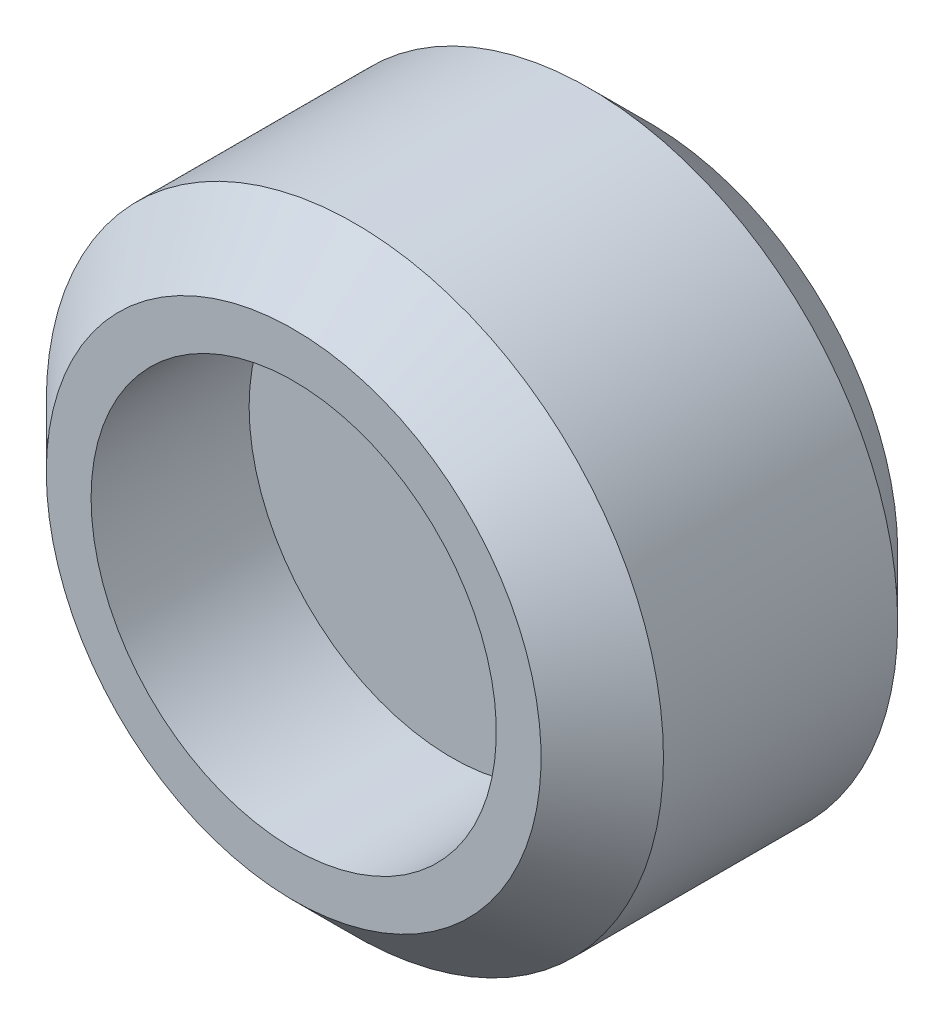
ISO-10303-21;
HEADER;
FILE_DESCRIPTION(('STEP AP214'),'2;1');
FILE_NAME('part.step','',(''),(''),'','','');
FILE_SCHEMA(('AUTOMOTIVE_DESIGN { 1 0 10303 214 1 1 1 1 }'));
ENDSEC;
DATA;
#1=APPLICATION_CONTEXT('core data for automotive mechanical design processes');
#2=APPLICATION_PROTOCOL_DEFINITION('international standard','automotive_design',2000,#1);
#3=PRODUCT_CONTEXT('',#1,'mechanical');
#4=PRODUCT('Part','Part','',(#3));
#5=PRODUCT_RELATED_PRODUCT_CATEGORY('part','',(#4));
#6=PRODUCT_DEFINITION_FORMATION('','',#4);
#7=PRODUCT_DEFINITION_CONTEXT('part definition',#1,'design');
#8=PRODUCT_DEFINITION('design','',#6,#7);
#9=PRODUCT_DEFINITION_SHAPE('','',#8);
#10=(LENGTH_UNIT() NAMED_UNIT(*) SI_UNIT(.MILLI.,.METRE.));
#11=(NAMED_UNIT(*) PLANE_ANGLE_UNIT() SI_UNIT($,.RADIAN.));
#12=(NAMED_UNIT(*) SI_UNIT($,.STERADIAN.) SOLID_ANGLE_UNIT());
#13=UNCERTAINTY_MEASURE_WITH_UNIT(LENGTH_MEASURE(1.E-05),#10,'distance_accuracy_value','');
#14=(GEOMETRIC_REPRESENTATION_CONTEXT(3) GLOBAL_UNCERTAINTY_ASSIGNED_CONTEXT((#13)) GLOBAL_UNIT_ASSIGNED_CONTEXT((#10,
#11,#12)) REPRESENTATION_CONTEXT('',''));
#15=CARTESIAN_POINT('',(0.,0.,0.));
#16=DIRECTION('',(0.,0.,1.));
#17=DIRECTION('',(1.,0.,0.));
#18=AXIS2_PLACEMENT_3D('',#15,#16,#17);
#19=CARTESIAN_POINT('',(0.,0.,4.9));
#20=DIRECTION('',(0.,0.,-1.));
#21=DIRECTION('',(-1.,0.,0.));
#22=AXIS2_PLACEMENT_3D('',#19,#20,#21);
#23=PLANE('',#22);
#24=CARTESIAN_POINT('',(0.,0.,4.9));
#25=DIRECTION('',(0.,0.,-1.));
#26=DIRECTION('',(-1.,0.,0.));
#27=AXIS2_PLACEMENT_3D('',#24,#25,#26);
#28=CIRCLE('',#27,5.);
#29=CARTESIAN_POINT('',(-5.,0.,4.9));
#30=VERTEX_POINT('',#29);
#31=EDGE_CURVE('E17',#30,#30,#28,.F.);
#32=ORIENTED_EDGE('',*,*,#31,.T.);
#33=EDGE_LOOP('',(#32));
#34=FACE_BOUND('',#33,.T.);
#35=ADVANCED_FACE('F14',(#34),#23,.F.);
#36=CARTESIAN_POINT('',(0.,0.,3.9));
#37=DIRECTION('',(0.,0.,1.));
#38=DIRECTION('',(1.,0.,0.));
#39=AXIS2_PLACEMENT_3D('',#36,#37,#38);
#40=PLANE('',#39);
#41=CARTESIAN_POINT('',(0.,0.,3.9));
#42=DIRECTION('',(0.,0.,1.));
#43=DIRECTION('',(1.,0.,0.));
#44=AXIS2_PLACEMENT_3D('',#41,#42,#43);
#45=CIRCLE('',#44,5.);
#46=CARTESIAN_POINT('',(5.,0.,3.9));
#47=VERTEX_POINT('',#46);
#48=EDGE_CURVE('E39',#47,#47,#45,.F.);
#49=ORIENTED_EDGE('',*,*,#48,.T.);
#50=EDGE_LOOP('',(#49));
#51=FACE_BOUND('',#50,.T.);
#52=ADVANCED_FACE('F51',(#51),#40,.F.);
#53=CARTESIAN_POINT('',(0.,0.,6.85));
#54=DIRECTION('',(0.,0.,-1.));
#55=DIRECTION('',(-1.,0.,0.));
#56=AXIS2_PLACEMENT_3D('',#53,#54,#55);
#57=CYLINDRICAL_SURFACE('',#56,5.);
#58=ORIENTED_EDGE('',*,*,#31,.F.);
#59=EDGE_LOOP('',(#58));
#60=FACE_BOUND('',#59,.T.);
#61=CARTESIAN_POINT('',(0.,0.,8.8));
#62=DIRECTION('',(0.,0.,-1.));
#63=DIRECTION('',(-1.,0.,0.));
#64=AXIS2_PLACEMENT_3D('',#61,#62,#63);
#65=CIRCLE('',#64,5.);
#66=CARTESIAN_POINT('',(-5.,0.,8.8));
#67=VERTEX_POINT('',#66);
#68=EDGE_CURVE('E37',#67,#67,#65,.T.);
#69=ORIENTED_EDGE('',*,*,#68,.F.);
#70=EDGE_LOOP('',(#69));
#71=FACE_BOUND('',#70,.T.);
#72=ADVANCED_FACE('F47',(#60,#71),#57,.F.);
#73=CARTESIAN_POINT('',(0.,0.,1.95));
#74=DIRECTION('',(0.,0.,1.));
#75=DIRECTION('',(1.,0.,0.));
#76=AXIS2_PLACEMENT_3D('',#73,#74,#75);
#77=CYLINDRICAL_SURFACE('',#76,5.);
#78=ORIENTED_EDGE('',*,*,#48,.F.);
#79=EDGE_LOOP('',(#78));
#80=FACE_BOUND('',#79,.T.);
#81=CARTESIAN_POINT('',(0.,0.,0.));
#82=DIRECTION('',(0.,0.,1.));
#83=DIRECTION('',(1.,0.,0.));
#84=AXIS2_PLACEMENT_3D('',#81,#82,#83);
#85=CIRCLE('',#84,5.);
#86=CARTESIAN_POINT('',(5.,0.,0.));
#87=VERTEX_POINT('',#86);
#88=EDGE_CURVE('E34',#87,#87,#85,.F.);
#89=ORIENTED_EDGE('',*,*,#88,.T.);
#90=EDGE_LOOP('',(#89));
#91=FACE_BOUND('',#90,.T.);
#92=ADVANCED_FACE('F50',(#80,#91),#77,.F.);
#93=CARTESIAN_POINT('',(0.,0.,8.8));
#94=DIRECTION('',(0.,0.,1.));
#95=DIRECTION('',(1.,0.,0.));
#96=AXIS2_PLACEMENT_3D('',#93,#94,#95);
#97=PLANE('',#96);
#98=ORIENTED_EDGE('',*,*,#68,.T.);
#99=EDGE_LOOP('',(#98));
#100=FACE_BOUND('',#99,.T.);
#101=CARTESIAN_POINT('',(0.,0.,8.80000000000791));
#102=DIRECTION('',(0.,0.,-1.));
#103=DIRECTION('',(-1.,0.,0.));
#104=AXIS2_PLACEMENT_3D('',#101,#102,#103);
#105=CIRCLE('',#104,6.10500000004777);
#106=CARTESIAN_POINT('',(-6.10500000004777,0.,8.80000000000791));
#107=VERTEX_POINT('',#106);
#108=EDGE_CURVE('E31',#107,#107,#105,.T.);
#109=ORIENTED_EDGE('',*,*,#108,.F.);
#110=EDGE_LOOP('',(#109));
#111=FACE_BOUND('',#110,.T.);
#112=ADVANCED_FACE('F55',(#100,#111),#97,.T.);
#113=CARTESIAN_POINT('',(0.,0.,0.));
#114=DIRECTION('',(0.,0.,1.));
#115=DIRECTION('',(1.,0.,0.));
#116=AXIS2_PLACEMENT_3D('',#113,#114,#115);
#117=PLANE('',#116);
#118=ORIENTED_EDGE('',*,*,#88,.F.);
#119=EDGE_LOOP('',(#118));
#120=FACE_BOUND('',#119,.T.);
#121=CARTESIAN_POINT('',(0.,0.,0.));
#122=DIRECTION('',(0.,0.,1.));
#123=DIRECTION('',(1.,0.,0.));
#124=AXIS2_PLACEMENT_3D('',#121,#122,#123);
#125=CIRCLE('',#124,6.10500000004777);
#126=CARTESIAN_POINT('',(6.10500000004777,0.,0.));
#127=VERTEX_POINT('',#126);
#128=EDGE_CURVE('E26',#127,#127,#125,.T.);
#129=ORIENTED_EDGE('',*,*,#128,.F.);
#130=EDGE_LOOP('',(#129));
#131=FACE_BOUND('',#130,.T.);
#132=ADVANCED_FACE('F58',(#120,#131),#117,.F.);
#133=CARTESIAN_POINT('',(0.,0.,7.28999999995494));
#134=DIRECTION('',(0.,0.,-1.));
#135=DIRECTION('',(-1.,0.,0.));
#136=AXIS2_PLACEMENT_3D('',#133,#134,#135);
#137=CONICAL_SURFACE('',#136,7.61500000004389,0.785398163378626);
#138=CARTESIAN_POINT('',(0.,0.,7.29));
#139=DIRECTION('',(0.,0.,1.));
#140=DIRECTION('',(1.,0.,0.));
#141=AXIS2_PLACEMENT_3D('',#138,#139,#140);
#142=CIRCLE('',#141,7.615);
#143=CARTESIAN_POINT('',(7.615,0.,7.29));
#144=VERTEX_POINT('',#143);
#145=EDGE_CURVE('E21',#144,#144,#142,.F.);
#146=ORIENTED_EDGE('',*,*,#145,.F.);
#147=EDGE_LOOP('',(#146));
#148=FACE_BOUND('',#147,.T.);
#149=ORIENTED_EDGE('',*,*,#108,.T.);
#150=EDGE_LOOP('',(#149));
#151=FACE_BOUND('',#150,.T.);
#152=ADVANCED_FACE('F62',(#148,#151),#137,.T.);
#153=CARTESIAN_POINT('',(0.,0.,1.50999999993928));
#154=DIRECTION('',(0.,0.,1.));
#155=DIRECTION('',(1.,0.,0.));
#156=AXIS2_PLACEMENT_3D('',#153,#154,#155);
#157=CONICAL_SURFACE('',#156,7.61499999998705,0.785398163397448);
#158=ORIENTED_EDGE('',*,*,#128,.T.);
#159=EDGE_LOOP('',(#158));
#160=FACE_BOUND('',#159,.T.);
#161=CARTESIAN_POINT('',(0.,0.,1.51));
#162=DIRECTION('',(0.,0.,1.));
#163=DIRECTION('',(1.,0.,0.));
#164=AXIS2_PLACEMENT_3D('',#161,#162,#163);
#165=CIRCLE('',#164,7.615);
#166=CARTESIAN_POINT('',(7.615,0.,1.51));
#167=VERTEX_POINT('',#166);
#168=EDGE_CURVE('E10',#167,#167,#165,.T.);
#169=ORIENTED_EDGE('',*,*,#168,.F.);
#170=EDGE_LOOP('',(#169));
#171=FACE_BOUND('',#170,.T.);
#172=ADVANCED_FACE('F64',(#160,#171),#157,.T.);
#173=CARTESIAN_POINT('',(0.,0.,0.));
#174=DIRECTION('',(0.,0.,1.));
#175=DIRECTION('',(1.,0.,0.));
#176=AXIS2_PLACEMENT_3D('',#173,#174,#175);
#177=CYLINDRICAL_SURFACE('',#176,7.615);
#178=ORIENTED_EDGE('',*,*,#168,.T.);
#179=EDGE_LOOP('',(#178));
#180=FACE_BOUND('',#179,.T.);
#181=ORIENTED_EDGE('',*,*,#145,.T.);
#182=EDGE_LOOP('',(#181));
#183=FACE_BOUND('',#182,.T.);
#184=ADVANCED_FACE('F72',(#180,#183),#177,.T.);
#185=CLOSED_SHELL('',(#35,#52,#72,#92,#112,#132,#152,#172,#184));
#186=MANIFOLD_SOLID_BREP('B1',#185);
#187=ADVANCED_BREP_SHAPE_REPRESENTATION('',(#18,#186),#14);
#188=SHAPE_DEFINITION_REPRESENTATION(#9,#187);
ENDSEC;
END-ISO-10303-21;
